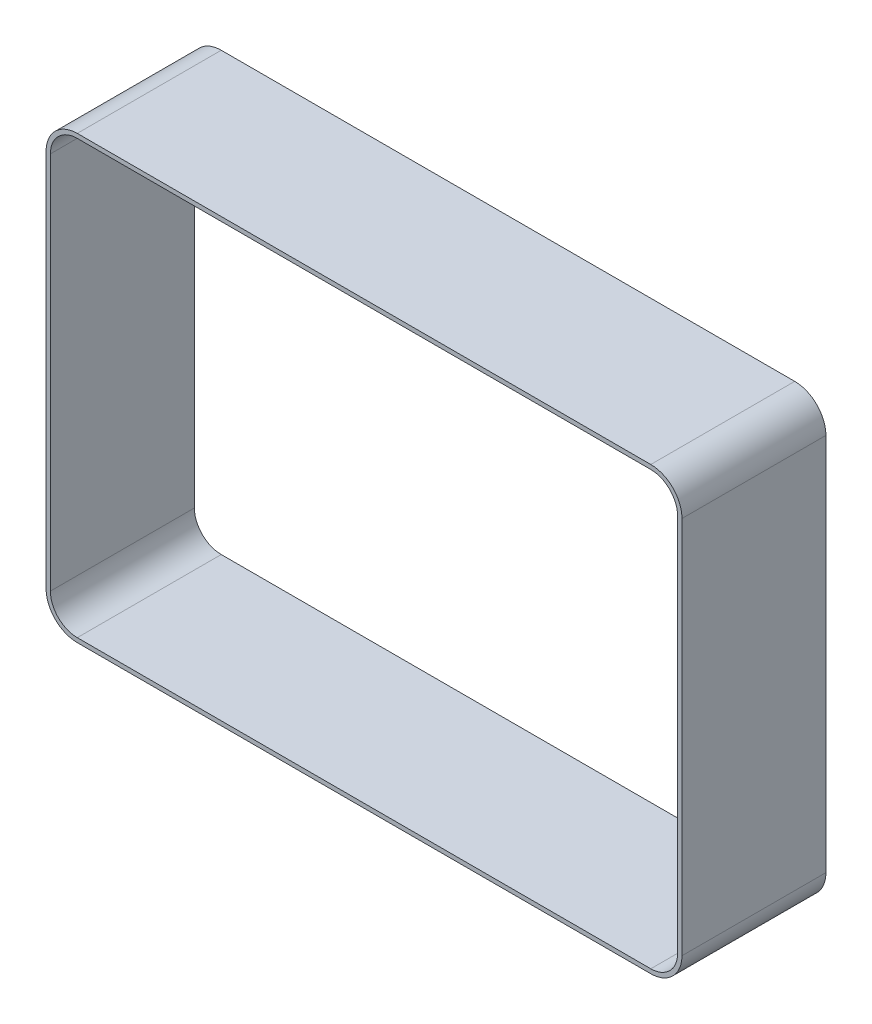
ISO-10303-21;
HEADER;
FILE_DESCRIPTION(('STEP AP214'),'2;1');
FILE_NAME('part.step','',(''),(''),'','','');
FILE_SCHEMA(('AUTOMOTIVE_DESIGN { 1 0 10303 214 1 1 1 1 }'));
ENDSEC;
DATA;
#1=APPLICATION_CONTEXT('core data for automotive mechanical design processes');
#2=APPLICATION_PROTOCOL_DEFINITION('international standard','automotive_design',2000,#1);
#3=PRODUCT_CONTEXT('',#1,'mechanical');
#4=PRODUCT('Part','Part','',(#3));
#5=PRODUCT_RELATED_PRODUCT_CATEGORY('part','',(#4));
#6=PRODUCT_DEFINITION_FORMATION('','',#4);
#7=PRODUCT_DEFINITION_CONTEXT('part definition',#1,'design');
#8=PRODUCT_DEFINITION('design','',#6,#7);
#9=PRODUCT_DEFINITION_SHAPE('','',#8);
#10=(LENGTH_UNIT() NAMED_UNIT(*) SI_UNIT(.MILLI.,.METRE.));
#11=(NAMED_UNIT(*) PLANE_ANGLE_UNIT() SI_UNIT($,.RADIAN.));
#12=(NAMED_UNIT(*) SI_UNIT($,.STERADIAN.) SOLID_ANGLE_UNIT());
#13=UNCERTAINTY_MEASURE_WITH_UNIT(LENGTH_MEASURE(1.E-05),#10,'distance_accuracy_value','');
#14=(GEOMETRIC_REPRESENTATION_CONTEXT(3) GLOBAL_UNCERTAINTY_ASSIGNED_CONTEXT((#13)) GLOBAL_UNIT_ASSIGNED_CONTEXT((#10,
#11,#12)) REPRESENTATION_CONTEXT('',''));
#15=CARTESIAN_POINT('',(0.,0.,0.));
#16=DIRECTION('',(0.,0.,1.));
#17=DIRECTION('',(1.,0.,0.));
#18=AXIS2_PLACEMENT_3D('',#15,#16,#17);
#19=CARTESIAN_POINT('',(-151.765,-100.203,76.2));
#20=DIRECTION('',(0.,0.,1.));
#21=DIRECTION('',(1.,0.,0.));
#22=AXIS2_PLACEMENT_3D('',#19,#20,#21);
#23=PLANE('',#22);
#24=CARTESIAN_POINT('',(-151.765,-100.203,76.2));
#25=DIRECTION('',(0.,0.,1.));
#26=DIRECTION('',(1.,0.,0.));
#27=AXIS2_PLACEMENT_3D('',#24,#25,#26);
#28=CIRCLE('',#27,16.51);
#29=CARTESIAN_POINT('',(-168.275,-100.203,76.2));
#30=VERTEX_POINT('',#29);
#31=CARTESIAN_POINT('',(-151.765,-116.713,76.2));
#32=VERTEX_POINT('',#31);
#33=EDGE_CURVE('E211',#30,#32,#28,.T.);
#34=ORIENTED_EDGE('',*,*,#33,.T.);
#35=DIRECTION('',(1.,0.,0.));
#36=VECTOR('',#35,1.);
#37=CARTESIAN_POINT('',(-151.765,-116.713,76.2));
#38=LINE('',#37,#36);
#39=CARTESIAN_POINT('',(151.765,-116.713,76.2));
#40=VERTEX_POINT('',#39);
#41=EDGE_CURVE('E214',#32,#40,#38,.T.);
#42=ORIENTED_EDGE('',*,*,#41,.T.);
#43=CARTESIAN_POINT('',(151.765,-100.203,76.2));
#44=DIRECTION('',(0.,0.,1.));
#45=DIRECTION('',(1.,0.,0.));
#46=AXIS2_PLACEMENT_3D('',#43,#44,#45);
#47=CIRCLE('',#46,16.51);
#48=CARTESIAN_POINT('',(168.275,-100.203,76.2));
#49=VERTEX_POINT('',#48);
#50=EDGE_CURVE('E217',#40,#49,#47,.T.);
#51=ORIENTED_EDGE('',*,*,#50,.T.);
#52=DIRECTION('',(0.,1.,0.));
#53=VECTOR('',#52,1.);
#54=CARTESIAN_POINT('',(168.275,-100.203,76.2));
#55=LINE('',#54,#53);
#56=CARTESIAN_POINT('',(168.275,100.203,76.2));
#57=VERTEX_POINT('',#56);
#58=EDGE_CURVE('E219',#49,#57,#55,.T.);
#59=ORIENTED_EDGE('',*,*,#58,.T.);
#60=CARTESIAN_POINT('',(151.765,100.203,76.2));
#61=DIRECTION('',(0.,0.,1.));
#62=DIRECTION('',(1.,0.,0.));
#63=AXIS2_PLACEMENT_3D('',#60,#61,#62);
#64=CIRCLE('',#63,16.51);
#65=CARTESIAN_POINT('',(151.765,116.713,76.2));
#66=VERTEX_POINT('',#65);
#67=EDGE_CURVE('E221',#57,#66,#64,.T.);
#68=ORIENTED_EDGE('',*,*,#67,.T.);
#69=DIRECTION('',(-1.,0.,0.));
#70=VECTOR('',#69,1.);
#71=CARTESIAN_POINT('',(-151.765,116.713,76.2));
#72=LINE('',#71,#70);
#73=CARTESIAN_POINT('',(-151.765,116.713,76.2));
#74=VERTEX_POINT('',#73);
#75=EDGE_CURVE('E223',#66,#74,#72,.T.);
#76=ORIENTED_EDGE('',*,*,#75,.T.);
#77=CARTESIAN_POINT('',(-151.765,100.203,76.2));
#78=DIRECTION('',(0.,0.,1.));
#79=DIRECTION('',(1.,0.,0.));
#80=AXIS2_PLACEMENT_3D('',#77,#78,#79);
#81=CIRCLE('',#80,16.51);
#82=CARTESIAN_POINT('',(-168.275,100.203,76.2));
#83=VERTEX_POINT('',#82);
#84=EDGE_CURVE('E225',#74,#83,#81,.T.);
#85=ORIENTED_EDGE('',*,*,#84,.T.);
#86=DIRECTION('',(0.,-1.,0.));
#87=VECTOR('',#86,1.);
#88=CARTESIAN_POINT('',(-168.275,-100.203,76.2));
#89=LINE('',#88,#87);
#90=EDGE_CURVE('E227',#83,#30,#89,.T.);
#91=ORIENTED_EDGE('',*,*,#90,.T.);
#92=EDGE_LOOP('',(#34,#42,#51,#59,#68,#76,#85,#91));
#93=FACE_BOUND('',#92,.T.);
#94=DIRECTION('',(1.,0.,0.));
#95=VECTOR('',#94,1.);
#96=CARTESIAN_POINT('',(-151.765,-114.427,76.2));
#97=LINE('',#96,#95);
#98=CARTESIAN_POINT('',(-151.765,-114.427,76.2));
#99=VERTEX_POINT('',#98);
#100=CARTESIAN_POINT('',(151.765,-114.427,76.2));
#101=VERTEX_POINT('',#100);
#102=EDGE_CURVE('E154',#99,#101,#97,.T.);
#103=ORIENTED_EDGE('',*,*,#102,.F.);
#104=CARTESIAN_POINT('',(-151.765,-100.203,76.2));
#105=DIRECTION('',(0.,0.,1.));
#106=DIRECTION('',(1.,0.,0.));
#107=AXIS2_PLACEMENT_3D('',#104,#105,#106);
#108=CIRCLE('',#107,14.224);
#109=CARTESIAN_POINT('',(-165.989,-100.203,76.2));
#110=VERTEX_POINT('',#109);
#111=EDGE_CURVE('E146',#110,#99,#108,.T.);
#112=ORIENTED_EDGE('',*,*,#111,.F.);
#113=DIRECTION('',(0.,-1.,0.));
#114=VECTOR('',#113,1.);
#115=CARTESIAN_POINT('',(-165.989,-100.203,76.2));
#116=LINE('',#115,#114);
#117=CARTESIAN_POINT('',(-165.989,100.203,76.2));
#118=VERTEX_POINT('',#117);
#119=EDGE_CURVE('E179',#118,#110,#116,.T.);
#120=ORIENTED_EDGE('',*,*,#119,.F.);
#121=CARTESIAN_POINT('',(-151.765,100.203,76.2));
#122=DIRECTION('',(0.,0.,1.));
#123=DIRECTION('',(1.,0.,0.));
#124=AXIS2_PLACEMENT_3D('',#121,#122,#123);
#125=CIRCLE('',#124,14.224);
#126=CARTESIAN_POINT('',(-151.765,114.427,76.2));
#127=VERTEX_POINT('',#126);
#128=EDGE_CURVE('E177',#127,#118,#125,.T.);
#129=ORIENTED_EDGE('',*,*,#128,.F.);
#130=DIRECTION('',(-1.,0.,0.));
#131=VECTOR('',#130,1.);
#132=CARTESIAN_POINT('',(-151.765,114.427,76.2));
#133=LINE('',#132,#131);
#134=CARTESIAN_POINT('',(151.765,114.427,76.2));
#135=VERTEX_POINT('',#134);
#136=EDGE_CURVE('E175',#135,#127,#133,.T.);
#137=ORIENTED_EDGE('',*,*,#136,.F.);
#138=CARTESIAN_POINT('',(151.765,100.203,76.2));
#139=DIRECTION('',(0.,0.,1.));
#140=DIRECTION('',(1.,0.,0.));
#141=AXIS2_PLACEMENT_3D('',#138,#139,#140);
#142=CIRCLE('',#141,14.224);
#143=CARTESIAN_POINT('',(165.989,100.203,76.2));
#144=VERTEX_POINT('',#143);
#145=EDGE_CURVE('E173',#144,#135,#142,.T.);
#146=ORIENTED_EDGE('',*,*,#145,.F.);
#147=DIRECTION('',(0.,1.,0.));
#148=VECTOR('',#147,1.);
#149=CARTESIAN_POINT('',(165.989,-100.203,76.2));
#150=LINE('',#149,#148);
#151=CARTESIAN_POINT('',(165.989,-100.203,76.2));
#152=VERTEX_POINT('',#151);
#153=EDGE_CURVE('E169',#152,#144,#150,.T.);
#154=ORIENTED_EDGE('',*,*,#153,.F.);
#155=CARTESIAN_POINT('',(151.765,-100.203,76.2));
#156=DIRECTION('',(0.,0.,1.));
#157=DIRECTION('',(1.,0.,0.));
#158=AXIS2_PLACEMENT_3D('',#155,#156,#157);
#159=CIRCLE('',#158,14.224);
#160=EDGE_CURVE('E167',#101,#152,#159,.T.);
#161=ORIENTED_EDGE('',*,*,#160,.F.);
#162=EDGE_LOOP('',(#103,#112,#120,#129,#137,#146,#154,#161));
#163=FACE_BOUND('',#162,.T.);
#164=ADVANCED_FACE('F33',(#93,#163),#23,.T.);
#165=CARTESIAN_POINT('',(-151.765,-100.203,0.));
#166=DIRECTION('',(0.,0.,1.));
#167=DIRECTION('',(1.,0.,0.));
#168=AXIS2_PLACEMENT_3D('',#165,#166,#167);
#169=PLANE('',#168);
#170=CARTESIAN_POINT('',(-151.765,-100.203,0.));
#171=DIRECTION('',(0.,0.,1.));
#172=DIRECTION('',(1.,0.,0.));
#173=AXIS2_PLACEMENT_3D('',#170,#171,#172);
#174=CIRCLE('',#173,16.51);
#175=CARTESIAN_POINT('',(-168.275,-100.203,0.));
#176=VERTEX_POINT('',#175);
#177=CARTESIAN_POINT('',(-151.765,-116.713,0.));
#178=VERTEX_POINT('',#177);
#179=EDGE_CURVE('E162',#176,#178,#174,.T.);
#180=ORIENTED_EDGE('',*,*,#179,.F.);
#181=DIRECTION('',(0.,-1.,0.));
#182=VECTOR('',#181,1.);
#183=CARTESIAN_POINT('',(-168.275,-100.203,0.));
#184=LINE('',#183,#182);
#185=CARTESIAN_POINT('',(-168.275,100.203,0.));
#186=VERTEX_POINT('',#185);
#187=EDGE_CURVE('E215',#186,#176,#184,.T.);
#188=ORIENTED_EDGE('',*,*,#187,.F.);
#189=CARTESIAN_POINT('',(-151.765,100.203,0.));
#190=DIRECTION('',(0.,0.,1.));
#191=DIRECTION('',(1.,0.,0.));
#192=AXIS2_PLACEMENT_3D('',#189,#190,#191);
#193=CIRCLE('',#192,16.51);
#194=CARTESIAN_POINT('',(-151.765,116.713,0.));
#195=VERTEX_POINT('',#194);
#196=EDGE_CURVE('E242',#195,#186,#193,.T.);
#197=ORIENTED_EDGE('',*,*,#196,.F.);
#198=DIRECTION('',(-1.,0.,0.));
#199=VECTOR('',#198,1.);
#200=CARTESIAN_POINT('',(-151.765,116.713,0.));
#201=LINE('',#200,#199);
#202=CARTESIAN_POINT('',(151.765,116.713,0.));
#203=VERTEX_POINT('',#202);
#204=EDGE_CURVE('E240',#203,#195,#201,.T.);
#205=ORIENTED_EDGE('',*,*,#204,.F.);
#206=CARTESIAN_POINT('',(151.765,100.203,0.));
#207=DIRECTION('',(0.,0.,1.));
#208=DIRECTION('',(1.,0.,0.));
#209=AXIS2_PLACEMENT_3D('',#206,#207,#208);
#210=CIRCLE('',#209,16.51);
#211=CARTESIAN_POINT('',(168.275,100.203,0.));
#212=VERTEX_POINT('',#211);
#213=EDGE_CURVE('E238',#212,#203,#210,.T.);
#214=ORIENTED_EDGE('',*,*,#213,.F.);
#215=DIRECTION('',(0.,1.,0.));
#216=VECTOR('',#215,1.);
#217=CARTESIAN_POINT('',(168.275,-100.203,0.));
#218=LINE('',#217,#216);
#219=CARTESIAN_POINT('',(168.275,-100.203,0.));
#220=VERTEX_POINT('',#219);
#221=EDGE_CURVE('E236',#220,#212,#218,.T.);
#222=ORIENTED_EDGE('',*,*,#221,.F.);
#223=CARTESIAN_POINT('',(151.765,-100.203,0.));
#224=DIRECTION('',(0.,0.,1.));
#225=DIRECTION('',(1.,0.,0.));
#226=AXIS2_PLACEMENT_3D('',#223,#224,#225);
#227=CIRCLE('',#226,16.51);
#228=CARTESIAN_POINT('',(151.765,-116.713,0.));
#229=VERTEX_POINT('',#228);
#230=EDGE_CURVE('E234',#229,#220,#227,.T.);
#231=ORIENTED_EDGE('',*,*,#230,.F.);
#232=DIRECTION('',(1.,0.,0.));
#233=VECTOR('',#232,1.);
#234=CARTESIAN_POINT('',(-151.765,-116.713,0.));
#235=LINE('',#234,#233);
#236=EDGE_CURVE('E232',#178,#229,#235,.T.);
#237=ORIENTED_EDGE('',*,*,#236,.F.);
#238=EDGE_LOOP('',(#180,#188,#197,#205,#214,#222,#231,#237));
#239=FACE_BOUND('',#238,.T.);
#240=CARTESIAN_POINT('',(-151.765,-100.203,0.));
#241=DIRECTION('',(0.,0.,1.));
#242=DIRECTION('',(1.,0.,0.));
#243=AXIS2_PLACEMENT_3D('',#240,#241,#242);
#244=CIRCLE('',#243,14.224);
#245=CARTESIAN_POINT('',(-165.989,-100.203,0.));
#246=VERTEX_POINT('',#245);
#247=CARTESIAN_POINT('',(-151.765,-114.427,0.));
#248=VERTEX_POINT('',#247);
#249=EDGE_CURVE('E56',#246,#248,#244,.T.);
#250=ORIENTED_EDGE('',*,*,#249,.T.);
#251=DIRECTION('',(1.,0.,0.));
#252=VECTOR('',#251,1.);
#253=CARTESIAN_POINT('',(-151.765,-114.427,0.));
#254=LINE('',#253,#252);
#255=CARTESIAN_POINT('',(151.765,-114.427,0.));
#256=VERTEX_POINT('',#255);
#257=EDGE_CURVE('E161',#248,#256,#254,.T.);
#258=ORIENTED_EDGE('',*,*,#257,.T.);
#259=CARTESIAN_POINT('',(151.765,-100.203,0.));
#260=DIRECTION('',(0.,0.,1.));
#261=DIRECTION('',(1.,0.,0.));
#262=AXIS2_PLACEMENT_3D('',#259,#260,#261);
#263=CIRCLE('',#262,14.224);
#264=CARTESIAN_POINT('',(165.989,-100.203,0.));
#265=VERTEX_POINT('',#264);
#266=EDGE_CURVE('E183',#256,#265,#263,.T.);
#267=ORIENTED_EDGE('',*,*,#266,.T.);
#268=DIRECTION('',(0.,1.,0.));
#269=VECTOR('',#268,1.);
#270=CARTESIAN_POINT('',(165.989,-100.203,0.));
#271=LINE('',#270,#269);
#272=CARTESIAN_POINT('',(165.989,100.203,0.));
#273=VERTEX_POINT('',#272);
#274=EDGE_CURVE('E186',#265,#273,#271,.T.);
#275=ORIENTED_EDGE('',*,*,#274,.T.);
#276=CARTESIAN_POINT('',(151.765,100.203,0.));
#277=DIRECTION('',(0.,0.,1.));
#278=DIRECTION('',(1.,0.,0.));
#279=AXIS2_PLACEMENT_3D('',#276,#277,#278);
#280=CIRCLE('',#279,14.224);
#281=CARTESIAN_POINT('',(151.765,114.427,0.));
#282=VERTEX_POINT('',#281);
#283=EDGE_CURVE('E189',#273,#282,#280,.T.);
#284=ORIENTED_EDGE('',*,*,#283,.T.);
#285=DIRECTION('',(-1.,0.,0.));
#286=VECTOR('',#285,1.);
#287=CARTESIAN_POINT('',(-151.765,114.427,0.));
#288=LINE('',#287,#286);
#289=CARTESIAN_POINT('',(-151.765,114.427,0.));
#290=VERTEX_POINT('',#289);
#291=EDGE_CURVE('E192',#282,#290,#288,.T.);
#292=ORIENTED_EDGE('',*,*,#291,.T.);
#293=CARTESIAN_POINT('',(-151.765,100.203,0.));
#294=DIRECTION('',(0.,0.,1.));
#295=DIRECTION('',(1.,0.,0.));
#296=AXIS2_PLACEMENT_3D('',#293,#294,#295);
#297=CIRCLE('',#296,14.224);
#298=CARTESIAN_POINT('',(-165.989,100.203,0.));
#299=VERTEX_POINT('',#298);
#300=EDGE_CURVE('E195',#290,#299,#297,.T.);
#301=ORIENTED_EDGE('',*,*,#300,.T.);
#302=DIRECTION('',(0.,-1.,0.));
#303=VECTOR('',#302,1.);
#304=CARTESIAN_POINT('',(-165.989,-100.203,0.));
#305=LINE('',#304,#303);
#306=EDGE_CURVE('E155',#299,#246,#305,.T.);
#307=ORIENTED_EDGE('',*,*,#306,.T.);
#308=EDGE_LOOP('',(#250,#258,#267,#275,#284,#292,#301,#307));
#309=FACE_BOUND('',#308,.T.);
#310=ADVANCED_FACE('F272',(#239,#309),#169,.F.);
#311=CARTESIAN_POINT('',(-151.765,-100.203,76.2));
#312=DIRECTION('',(0.,0.,-1.));
#313=DIRECTION('',(-1.,0.,0.));
#314=AXIS2_PLACEMENT_3D('',#311,#312,#313);
#315=CYLINDRICAL_SURFACE('',#314,16.51);
#316=ORIENTED_EDGE('',*,*,#179,.T.);
#317=DIRECTION('',(0.,0.,-1.));
#318=VECTOR('',#317,1.);
#319=CARTESIAN_POINT('',(-151.765,-116.713,76.2));
#320=LINE('',#319,#318);
#321=EDGE_CURVE('E11',#32,#178,#320,.T.);
#322=ORIENTED_EDGE('',*,*,#321,.F.);
#323=ORIENTED_EDGE('',*,*,#33,.F.);
#324=DIRECTION('',(0.,0.,-1.));
#325=VECTOR('',#324,1.);
#326=CARTESIAN_POINT('',(-168.275,-100.203,76.2));
#327=LINE('',#326,#325);
#328=EDGE_CURVE('E229',#30,#176,#327,.T.);
#329=ORIENTED_EDGE('',*,*,#328,.T.);
#330=EDGE_LOOP('',(#316,#322,#323,#329));
#331=FACE_BOUND('',#330,.T.);
#332=ADVANCED_FACE('F35',(#331),#315,.T.);
#333=CARTESIAN_POINT('',(-151.765,-116.713,76.2));
#334=DIRECTION('',(0.,1.,0.));
#335=DIRECTION('',(0.,0.,1.));
#336=AXIS2_PLACEMENT_3D('',#333,#334,#335);
#337=PLANE('',#336);
#338=ORIENTED_EDGE('',*,*,#236,.T.);
#339=DIRECTION('',(0.,0.,-1.));
#340=VECTOR('',#339,1.);
#341=CARTESIAN_POINT('',(151.765,-116.713,76.2));
#342=LINE('',#341,#340);
#343=EDGE_CURVE('E41',#40,#229,#342,.T.);
#344=ORIENTED_EDGE('',*,*,#343,.F.);
#345=ORIENTED_EDGE('',*,*,#41,.F.);
#346=ORIENTED_EDGE('',*,*,#321,.T.);
#347=EDGE_LOOP('',(#338,#344,#345,#346));
#348=FACE_BOUND('',#347,.T.);
#349=ADVANCED_FACE('F289',(#348),#337,.F.);
#350=CARTESIAN_POINT('',(151.765,-100.203,76.2));
#351=DIRECTION('',(0.,0.,-1.));
#352=DIRECTION('',(-1.,0.,0.));
#353=AXIS2_PLACEMENT_3D('',#350,#351,#352);
#354=CYLINDRICAL_SURFACE('',#353,16.51);
#355=ORIENTED_EDGE('',*,*,#230,.T.);
#356=DIRECTION('',(0.,0.,-1.));
#357=VECTOR('',#356,1.);
#358=CARTESIAN_POINT('',(168.275,-100.203,76.2));
#359=LINE('',#358,#357);
#360=EDGE_CURVE('E259',#49,#220,#359,.T.);
#361=ORIENTED_EDGE('',*,*,#360,.F.);
#362=ORIENTED_EDGE('',*,*,#50,.F.);
#363=ORIENTED_EDGE('',*,*,#343,.T.);
#364=EDGE_LOOP('',(#355,#361,#362,#363));
#365=FACE_BOUND('',#364,.T.);
#366=ADVANCED_FACE('F266',(#365),#354,.T.);
#367=CARTESIAN_POINT('',(168.275,-100.203,76.2));
#368=DIRECTION('',(-1.,0.,0.));
#369=DIRECTION('',(0.,0.,1.));
#370=AXIS2_PLACEMENT_3D('',#367,#368,#369);
#371=PLANE('',#370);
#372=ORIENTED_EDGE('',*,*,#221,.T.);
#373=DIRECTION('',(0.,0.,-1.));
#374=VECTOR('',#373,1.);
#375=CARTESIAN_POINT('',(168.275,100.203,76.2));
#376=LINE('',#375,#374);
#377=EDGE_CURVE('E256',#57,#212,#376,.T.);
#378=ORIENTED_EDGE('',*,*,#377,.F.);
#379=ORIENTED_EDGE('',*,*,#58,.F.);
#380=ORIENTED_EDGE('',*,*,#360,.T.);
#381=EDGE_LOOP('',(#372,#378,#379,#380));
#382=FACE_BOUND('',#381,.T.);
#383=ADVANCED_FACE('F278',(#382),#371,.F.);
#384=CARTESIAN_POINT('',(151.765,100.203,76.2));
#385=DIRECTION('',(0.,0.,-1.));
#386=DIRECTION('',(-1.,0.,0.));
#387=AXIS2_PLACEMENT_3D('',#384,#385,#386);
#388=CYLINDRICAL_SURFACE('',#387,16.51);
#389=ORIENTED_EDGE('',*,*,#213,.T.);
#390=DIRECTION('',(0.,0.,-1.));
#391=VECTOR('',#390,1.);
#392=CARTESIAN_POINT('',(151.765,116.713,76.2));
#393=LINE('',#392,#391);
#394=EDGE_CURVE('E253',#66,#203,#393,.T.);
#395=ORIENTED_EDGE('',*,*,#394,.F.);
#396=ORIENTED_EDGE('',*,*,#67,.F.);
#397=ORIENTED_EDGE('',*,*,#377,.T.);
#398=EDGE_LOOP('',(#389,#395,#396,#397));
#399=FACE_BOUND('',#398,.T.);
#400=ADVANCED_FACE('F282',(#399),#388,.T.);
#401=CARTESIAN_POINT('',(-151.765,116.713,76.2));
#402=DIRECTION('',(0.,-1.,0.));
#403=DIRECTION('',(1.,0.,0.));
#404=AXIS2_PLACEMENT_3D('',#401,#402,#403);
#405=PLANE('',#404);
#406=ORIENTED_EDGE('',*,*,#204,.T.);
#407=DIRECTION('',(0.,0.,-1.));
#408=VECTOR('',#407,1.);
#409=CARTESIAN_POINT('',(-151.765,116.713,76.2));
#410=LINE('',#409,#408);
#411=EDGE_CURVE('E250',#74,#195,#410,.T.);
#412=ORIENTED_EDGE('',*,*,#411,.F.);
#413=ORIENTED_EDGE('',*,*,#75,.F.);
#414=ORIENTED_EDGE('',*,*,#394,.T.);
#415=EDGE_LOOP('',(#406,#412,#413,#414));
#416=FACE_BOUND('',#415,.T.);
#417=ADVANCED_FACE('F302',(#416),#405,.F.);
#418=CARTESIAN_POINT('',(-151.765,100.203,76.2));
#419=DIRECTION('',(0.,0.,-1.));
#420=DIRECTION('',(-1.,0.,0.));
#421=AXIS2_PLACEMENT_3D('',#418,#419,#420);
#422=CYLINDRICAL_SURFACE('',#421,16.51);
#423=ORIENTED_EDGE('',*,*,#196,.T.);
#424=DIRECTION('',(0.,0.,-1.));
#425=VECTOR('',#424,1.);
#426=CARTESIAN_POINT('',(-168.275,100.203,76.2));
#427=LINE('',#426,#425);
#428=EDGE_CURVE('E247',#83,#186,#427,.T.);
#429=ORIENTED_EDGE('',*,*,#428,.F.);
#430=ORIENTED_EDGE('',*,*,#84,.F.);
#431=ORIENTED_EDGE('',*,*,#411,.T.);
#432=EDGE_LOOP('',(#423,#429,#430,#431));
#433=FACE_BOUND('',#432,.T.);
#434=ADVANCED_FACE('F300',(#433),#422,.T.);
#435=CARTESIAN_POINT('',(-168.275,-100.203,76.2));
#436=DIRECTION('',(1.,0.,0.));
#437=DIRECTION('',(0.,0.,-1.));
#438=AXIS2_PLACEMENT_3D('',#435,#436,#437);
#439=PLANE('',#438);
#440=ORIENTED_EDGE('',*,*,#187,.T.);
#441=ORIENTED_EDGE('',*,*,#328,.F.);
#442=ORIENTED_EDGE('',*,*,#90,.F.);
#443=ORIENTED_EDGE('',*,*,#428,.T.);
#444=EDGE_LOOP('',(#440,#441,#442,#443));
#445=FACE_BOUND('',#444,.T.);
#446=ADVANCED_FACE('F295',(#445),#439,.F.);
#447=CARTESIAN_POINT('',(-151.765,-100.203,76.2));
#448=DIRECTION('',(0.,0.,-1.));
#449=DIRECTION('',(-1.,0.,0.));
#450=AXIS2_PLACEMENT_3D('',#447,#448,#449);
#451=CYLINDRICAL_SURFACE('',#450,14.224);
#452=ORIENTED_EDGE('',*,*,#249,.F.);
#453=DIRECTION('',(0.,0.,-1.));
#454=VECTOR('',#453,1.);
#455=CARTESIAN_POINT('',(-165.989,-100.203,76.2));
#456=LINE('',#455,#454);
#457=EDGE_CURVE('E150',#110,#246,#456,.T.);
#458=ORIENTED_EDGE('',*,*,#457,.F.);
#459=ORIENTED_EDGE('',*,*,#111,.T.);
#460=DIRECTION('',(0.,0.,-1.));
#461=VECTOR('',#460,1.);
#462=CARTESIAN_POINT('',(-151.765,-114.427,76.2));
#463=LINE('',#462,#461);
#464=EDGE_CURVE('E149',#99,#248,#463,.T.);
#465=ORIENTED_EDGE('',*,*,#464,.T.);
#466=EDGE_LOOP('',(#452,#458,#459,#465));
#467=FACE_BOUND('',#466,.T.);
#468=ADVANCED_FACE('F148',(#467),#451,.F.);
#469=CARTESIAN_POINT('',(-151.765,-114.427,76.2));
#470=DIRECTION('',(0.,1.,0.));
#471=DIRECTION('',(0.,0.,1.));
#472=AXIS2_PLACEMENT_3D('',#469,#470,#471);
#473=PLANE('',#472);
#474=ORIENTED_EDGE('',*,*,#257,.F.);
#475=ORIENTED_EDGE('',*,*,#464,.F.);
#476=ORIENTED_EDGE('',*,*,#102,.T.);
#477=DIRECTION('',(0.,0.,-1.));
#478=VECTOR('',#477,1.);
#479=CARTESIAN_POINT('',(151.765,-114.427,76.2));
#480=LINE('',#479,#478);
#481=EDGE_CURVE('E163',#101,#256,#480,.T.);
#482=ORIENTED_EDGE('',*,*,#481,.T.);
#483=EDGE_LOOP('',(#474,#475,#476,#482));
#484=FACE_BOUND('',#483,.T.);
#485=ADVANCED_FACE('F158',(#484),#473,.T.);
#486=CARTESIAN_POINT('',(151.765,-100.203,76.2));
#487=DIRECTION('',(0.,0.,-1.));
#488=DIRECTION('',(-1.,0.,0.));
#489=AXIS2_PLACEMENT_3D('',#486,#487,#488);
#490=CYLINDRICAL_SURFACE('',#489,14.224);
#491=ORIENTED_EDGE('',*,*,#266,.F.);
#492=ORIENTED_EDGE('',*,*,#481,.F.);
#493=ORIENTED_EDGE('',*,*,#160,.T.);
#494=DIRECTION('',(0.,0.,-1.));
#495=VECTOR('',#494,1.);
#496=CARTESIAN_POINT('',(165.989,-100.203,76.2));
#497=LINE('',#496,#495);
#498=EDGE_CURVE('E208',#152,#265,#497,.T.);
#499=ORIENTED_EDGE('',*,*,#498,.T.);
#500=EDGE_LOOP('',(#491,#492,#493,#499));
#501=FACE_BOUND('',#500,.T.);
#502=ADVANCED_FACE('F327',(#501),#490,.F.);
#503=CARTESIAN_POINT('',(165.989,-100.203,76.2));
#504=DIRECTION('',(-1.,0.,0.));
#505=DIRECTION('',(0.,-1.,0.));
#506=AXIS2_PLACEMENT_3D('',#503,#504,#505);
#507=PLANE('',#506);
#508=ORIENTED_EDGE('',*,*,#274,.F.);
#509=ORIENTED_EDGE('',*,*,#498,.F.);
#510=ORIENTED_EDGE('',*,*,#153,.T.);
#511=DIRECTION('',(0.,0.,-1.));
#512=VECTOR('',#511,1.);
#513=CARTESIAN_POINT('',(165.989,100.203,76.2));
#514=LINE('',#513,#512);
#515=EDGE_CURVE('E206',#144,#273,#514,.T.);
#516=ORIENTED_EDGE('',*,*,#515,.T.);
#517=EDGE_LOOP('',(#508,#509,#510,#516));
#518=FACE_BOUND('',#517,.T.);
#519=ADVANCED_FACE('F331',(#518),#507,.T.);
#520=CARTESIAN_POINT('',(151.765,100.203,76.2));
#521=DIRECTION('',(0.,0.,-1.));
#522=DIRECTION('',(-1.,0.,0.));
#523=AXIS2_PLACEMENT_3D('',#520,#521,#522);
#524=CYLINDRICAL_SURFACE('',#523,14.224);
#525=ORIENTED_EDGE('',*,*,#283,.F.);
#526=ORIENTED_EDGE('',*,*,#515,.F.);
#527=ORIENTED_EDGE('',*,*,#145,.T.);
#528=DIRECTION('',(0.,0.,-1.));
#529=VECTOR('',#528,1.);
#530=CARTESIAN_POINT('',(151.765,114.427,76.2));
#531=LINE('',#530,#529);
#532=EDGE_CURVE('E204',#135,#282,#531,.T.);
#533=ORIENTED_EDGE('',*,*,#532,.T.);
#534=EDGE_LOOP('',(#525,#526,#527,#533));
#535=FACE_BOUND('',#534,.T.);
#536=ADVANCED_FACE('F337',(#535),#524,.F.);
#537=CARTESIAN_POINT('',(-151.765,114.427,76.2));
#538=DIRECTION('',(0.,-1.,0.));
#539=DIRECTION('',(0.,0.,-1.));
#540=AXIS2_PLACEMENT_3D('',#537,#538,#539);
#541=PLANE('',#540);
#542=ORIENTED_EDGE('',*,*,#291,.F.);
#543=ORIENTED_EDGE('',*,*,#532,.F.);
#544=ORIENTED_EDGE('',*,*,#136,.T.);
#545=DIRECTION('',(0.,0.,-1.));
#546=VECTOR('',#545,1.);
#547=CARTESIAN_POINT('',(-151.765,114.427,76.2));
#548=LINE('',#547,#546);
#549=EDGE_CURVE('E202',#127,#290,#548,.T.);
#550=ORIENTED_EDGE('',*,*,#549,.T.);
#551=EDGE_LOOP('',(#542,#543,#544,#550));
#552=FACE_BOUND('',#551,.T.);
#553=ADVANCED_FACE('F341',(#552),#541,.T.);
#554=CARTESIAN_POINT('',(-151.765,100.203,76.2));
#555=DIRECTION('',(0.,0.,-1.));
#556=DIRECTION('',(-1.,0.,0.));
#557=AXIS2_PLACEMENT_3D('',#554,#555,#556);
#558=CYLINDRICAL_SURFACE('',#557,14.224);
#559=ORIENTED_EDGE('',*,*,#300,.F.);
#560=ORIENTED_EDGE('',*,*,#549,.F.);
#561=ORIENTED_EDGE('',*,*,#128,.T.);
#562=DIRECTION('',(0.,0.,-1.));
#563=VECTOR('',#562,1.);
#564=CARTESIAN_POINT('',(-165.989,100.203,76.2));
#565=LINE('',#564,#563);
#566=EDGE_CURVE('E48',#118,#299,#565,.T.);
#567=ORIENTED_EDGE('',*,*,#566,.T.);
#568=EDGE_LOOP('',(#559,#560,#561,#567));
#569=FACE_BOUND('',#568,.T.);
#570=ADVANCED_FACE('F345',(#569),#558,.F.);
#571=CARTESIAN_POINT('',(-165.989,-100.203,76.2));
#572=DIRECTION('',(1.,0.,0.));
#573=DIRECTION('',(0.,1.,0.));
#574=AXIS2_PLACEMENT_3D('',#571,#572,#573);
#575=PLANE('',#574);
#576=ORIENTED_EDGE('',*,*,#306,.F.);
#577=ORIENTED_EDGE('',*,*,#566,.F.);
#578=ORIENTED_EDGE('',*,*,#119,.T.);
#579=ORIENTED_EDGE('',*,*,#457,.T.);
#580=EDGE_LOOP('',(#576,#577,#578,#579));
#581=FACE_BOUND('',#580,.T.);
#582=ADVANCED_FACE('F349',(#581),#575,.T.);
#583=CLOSED_SHELL('',(#164,#310,#332,#349,#366,#383,#400,#417,#434,#446,#468,#485,#502,#519,
#536,#553,#570,#582));
#584=MANIFOLD_SOLID_BREP('B2',#583);
#585=ADVANCED_BREP_SHAPE_REPRESENTATION('',(#18,#584),#14);
#586=SHAPE_DEFINITION_REPRESENTATION(#9,#585);
ENDSEC;
END-ISO-10303-21;
